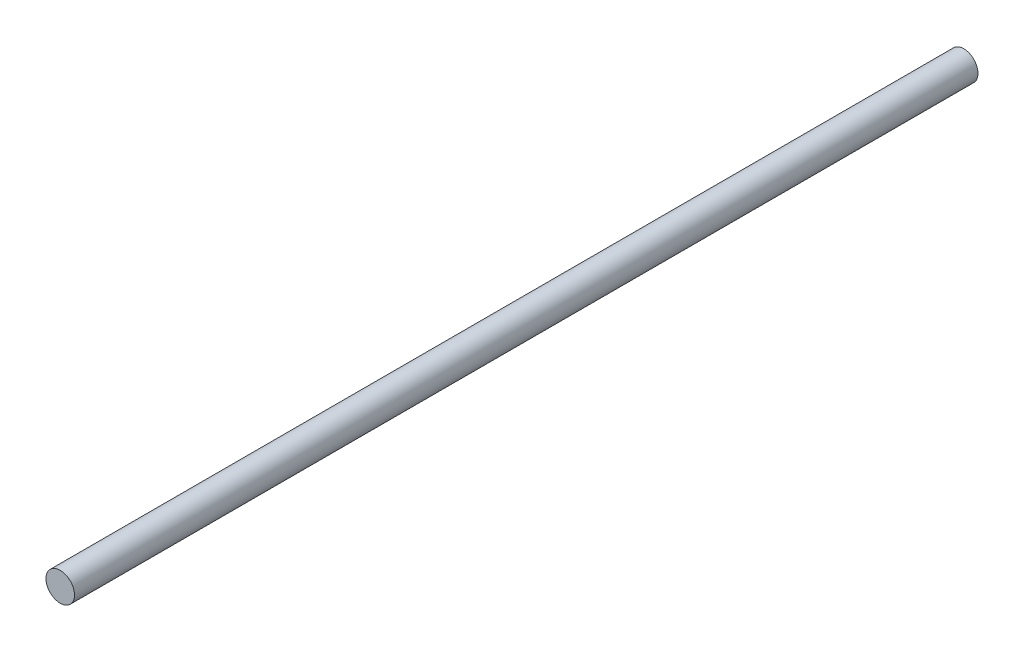
ISO-10303-21;
HEADER;
FILE_DESCRIPTION(('STEP AP214'),'2;1');
FILE_NAME('part.step','',(''),(''),'','','');
FILE_SCHEMA(('AUTOMOTIVE_DESIGN { 1 0 10303 214 1 1 1 1 }'));
ENDSEC;
DATA;
#1=APPLICATION_CONTEXT('core data for automotive mechanical design processes');
#2=APPLICATION_PROTOCOL_DEFINITION('international standard','automotive_design',2000,#1);
#3=PRODUCT_CONTEXT('',#1,'mechanical');
#4=PRODUCT('Part','Part','',(#3));
#5=PRODUCT_RELATED_PRODUCT_CATEGORY('part','',(#4));
#6=PRODUCT_DEFINITION_FORMATION('','',#4);
#7=PRODUCT_DEFINITION_CONTEXT('part definition',#1,'design');
#8=PRODUCT_DEFINITION('design','',#6,#7);
#9=PRODUCT_DEFINITION_SHAPE('','',#8);
#10=(LENGTH_UNIT() NAMED_UNIT(*) SI_UNIT(.MILLI.,.METRE.));
#11=(NAMED_UNIT(*) PLANE_ANGLE_UNIT() SI_UNIT($,.RADIAN.));
#12=(NAMED_UNIT(*) SI_UNIT($,.STERADIAN.) SOLID_ANGLE_UNIT());
#13=UNCERTAINTY_MEASURE_WITH_UNIT(LENGTH_MEASURE(1.E-05),#10,'distance_accuracy_value','');
#14=(GEOMETRIC_REPRESENTATION_CONTEXT(3) GLOBAL_UNCERTAINTY_ASSIGNED_CONTEXT((#13)) GLOBAL_UNIT_ASSIGNED_CONTEXT((#10,
#11,#12)) REPRESENTATION_CONTEXT('',''));
#15=CARTESIAN_POINT('',(0.,0.,0.));
#16=DIRECTION('',(0.,0.,1.));
#17=DIRECTION('',(1.,0.,0.));
#18=AXIS2_PLACEMENT_3D('',#15,#16,#17);
#19=CARTESIAN_POINT('',(0.,0.,95.));
#20=DIRECTION('',(0.,0.,-1.));
#21=DIRECTION('',(-1.,0.,0.));
#22=AXIS2_PLACEMENT_3D('',#19,#20,#21);
#23=CYLINDRICAL_SURFACE('',#22,1.5);
#24=CARTESIAN_POINT('',(0.,0.,95.));
#25=DIRECTION('',(0.,0.,1.));
#26=DIRECTION('',(1.,0.,0.));
#27=AXIS2_PLACEMENT_3D('',#24,#25,#26);
#28=CIRCLE('',#27,1.5);
#29=CARTESIAN_POINT('',(1.5,0.,95.));
#30=VERTEX_POINT('',#29);
#31=EDGE_CURVE('E10',#30,#30,#28,.T.);
#32=ORIENTED_EDGE('',*,*,#31,.F.);
#33=EDGE_LOOP('',(#32));
#34=FACE_BOUND('',#33,.T.);
#35=CARTESIAN_POINT('',(0.,0.,0.));
#36=DIRECTION('',(0.,0.,1.));
#37=DIRECTION('',(1.,0.,0.));
#38=AXIS2_PLACEMENT_3D('',#35,#36,#37);
#39=CIRCLE('',#38,1.5);
#40=CARTESIAN_POINT('',(1.5,0.,0.));
#41=VERTEX_POINT('',#40);
#42=EDGE_CURVE('E34',#41,#41,#39,.T.);
#43=ORIENTED_EDGE('',*,*,#42,.T.);
#44=EDGE_LOOP('',(#43));
#45=FACE_BOUND('',#44,.T.);
#46=ADVANCED_FACE('F31',(#34,#45),#23,.T.);
#47=CARTESIAN_POINT('',(0.,0.,95.));
#48=DIRECTION('',(0.,0.,1.));
#49=DIRECTION('',(1.,0.,0.));
#50=AXIS2_PLACEMENT_3D('',#47,#48,#49);
#51=PLANE('',#50);
#52=ORIENTED_EDGE('',*,*,#31,.T.);
#53=EDGE_LOOP('',(#52));
#54=FACE_BOUND('',#53,.T.);
#55=ADVANCED_FACE('F46',(#54),#51,.T.);
#56=CARTESIAN_POINT('',(0.,0.,0.));
#57=DIRECTION('',(0.,0.,1.));
#58=DIRECTION('',(1.,0.,0.));
#59=AXIS2_PLACEMENT_3D('',#56,#57,#58);
#60=PLANE('',#59);
#61=ORIENTED_EDGE('',*,*,#42,.F.);
#62=EDGE_LOOP('',(#61));
#63=FACE_BOUND('',#62,.T.);
#64=ADVANCED_FACE('F44',(#63),#60,.F.);
#65=CLOSED_SHELL('',(#46,#55,#64));
#66=MANIFOLD_SOLID_BREP('B2',#65);
#67=ADVANCED_BREP_SHAPE_REPRESENTATION('',(#18,#66),#14);
#68=SHAPE_DEFINITION_REPRESENTATION(#9,#67);
ENDSEC;
END-ISO-10303-21;
